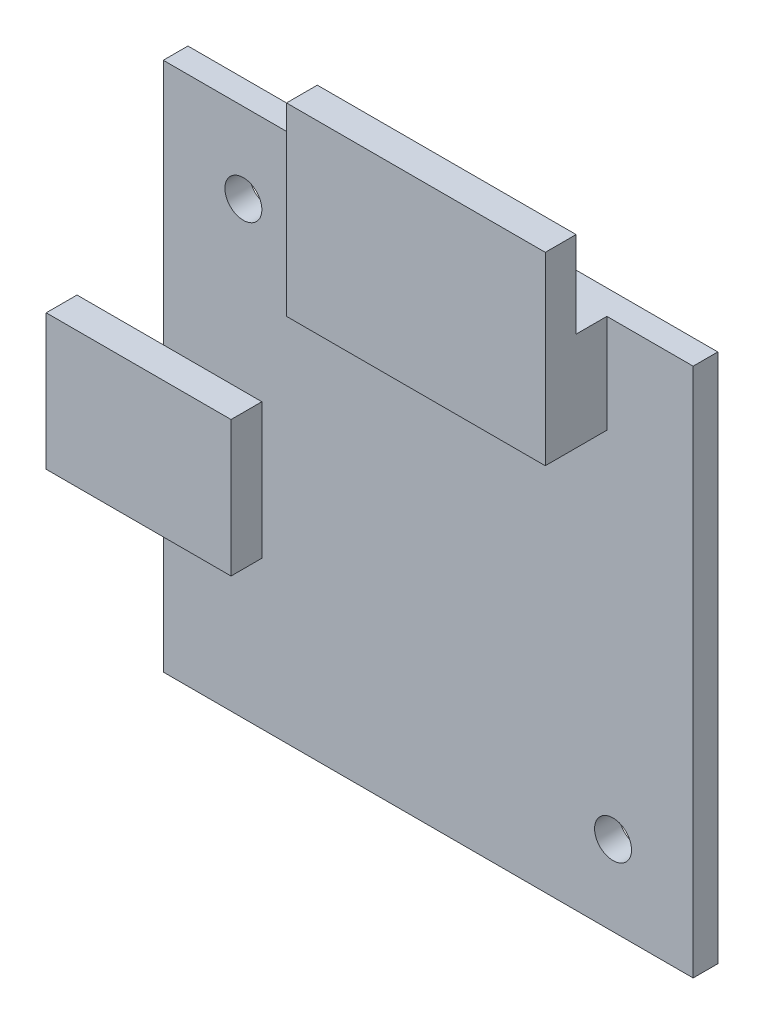
ISO-10303-21;
HEADER;
FILE_DESCRIPTION(('STEP AP214'),'2;1');
FILE_NAME('part.step','',(''),(''),'','','');
FILE_SCHEMA(('AUTOMOTIVE_DESIGN { 1 0 10303 214 1 1 1 1 }'));
ENDSEC;
DATA;
#1=APPLICATION_CONTEXT('core data for automotive mechanical design processes');
#2=APPLICATION_PROTOCOL_DEFINITION('international standard','automotive_design',2000,#1);
#3=PRODUCT_CONTEXT('',#1,'mechanical');
#4=PRODUCT('Part','Part','',(#3));
#5=PRODUCT_RELATED_PRODUCT_CATEGORY('part','',(#4));
#6=PRODUCT_DEFINITION_FORMATION('','',#4);
#7=PRODUCT_DEFINITION_CONTEXT('part definition',#1,'design');
#8=PRODUCT_DEFINITION('design','',#6,#7);
#9=PRODUCT_DEFINITION_SHAPE('','',#8);
#10=(LENGTH_UNIT() NAMED_UNIT(*) SI_UNIT(.MILLI.,.METRE.));
#11=(NAMED_UNIT(*) PLANE_ANGLE_UNIT() SI_UNIT($,.RADIAN.));
#12=(NAMED_UNIT(*) SI_UNIT($,.STERADIAN.) SOLID_ANGLE_UNIT());
#13=UNCERTAINTY_MEASURE_WITH_UNIT(LENGTH_MEASURE(1.E-05),#10,'distance_accuracy_value','');
#14=(GEOMETRIC_REPRESENTATION_CONTEXT(3) GLOBAL_UNCERTAINTY_ASSIGNED_CONTEXT((#13)) GLOBAL_UNIT_ASSIGNED_CONTEXT((#10,
#11,#12)) REPRESENTATION_CONTEXT('',''));
#15=CARTESIAN_POINT('',(0.,0.,0.));
#16=DIRECTION('',(0.,0.,1.));
#17=DIRECTION('',(1.,0.,0.));
#18=AXIS2_PLACEMENT_3D('',#15,#16,#17);
#19=CARTESIAN_POINT('',(15.,50.,7.));
#20=DIRECTION('',(0.,-1.,0.));
#21=DIRECTION('',(0.,0.,-1.));
#22=AXIS2_PLACEMENT_3D('',#19,#20,#21);
#23=PLANE('',#22);
#24=DIRECTION('',(1.,0.,0.));
#25=VECTOR('',#24,1.);
#26=CARTESIAN_POINT('',(36.,50.,4.5));
#27=LINE('',#26,#25);
#28=CARTESIAN_POINT('',(15.,50.,4.5));
#29=VERTEX_POINT('',#28);
#30=CARTESIAN_POINT('',(36.,50.,4.5));
#31=VERTEX_POINT('',#30);
#32=EDGE_CURVE('E172',#29,#31,#27,.T.);
#33=ORIENTED_EDGE('',*,*,#32,.F.);
#34=DIRECTION('',(0.,0.,-1.));
#35=VECTOR('',#34,1.);
#36=CARTESIAN_POINT('',(15.,50.,7.));
#37=LINE('',#36,#35);
#38=CARTESIAN_POINT('',(15.,50.,7.));
#39=VERTEX_POINT('',#38);
#40=EDGE_CURVE('E223',#39,#29,#37,.T.);
#41=ORIENTED_EDGE('',*,*,#40,.F.);
#42=DIRECTION('',(-1.,0.,0.));
#43=VECTOR('',#42,1.);
#44=CARTESIAN_POINT('',(15.,50.,7.));
#45=LINE('',#44,#43);
#46=CARTESIAN_POINT('',(36.,50.,7.));
#47=VERTEX_POINT('',#46);
#48=EDGE_CURVE('E222',#47,#39,#45,.T.);
#49=ORIENTED_EDGE('',*,*,#48,.F.);
#50=DIRECTION('',(0.,0.,-1.));
#51=VECTOR('',#50,1.);
#52=CARTESIAN_POINT('',(36.,50.,7.));
#53=LINE('',#52,#51);
#54=EDGE_CURVE('E230',#47,#31,#53,.T.);
#55=ORIENTED_EDGE('',*,*,#54,.T.);
#56=EDGE_LOOP('',(#33,#41,#49,#55));
#57=FACE_BOUND('',#56,.T.);
#58=ADVANCED_FACE('F47',(#57),#23,.F.);
#59=CARTESIAN_POINT('',(0.,0.,2.));
#60=DIRECTION('',(0.,0.,-1.));
#61=DIRECTION('',(-1.,0.,0.));
#62=AXIS2_PLACEMENT_3D('',#59,#60,#61);
#63=PLANE('',#62);
#64=CARTESIAN_POINT('',(36.5,6.5,2.));
#65=DIRECTION('',(0.,0.,1.));
#66=DIRECTION('',(1.,0.,0.));
#67=AXIS2_PLACEMENT_3D('',#64,#65,#66);
#68=CIRCLE('',#67,1.5);
#69=CARTESIAN_POINT('',(38.,6.5,2.));
#70=VERTEX_POINT('',#69);
#71=EDGE_CURVE('E238',#70,#70,#68,.T.);
#72=ORIENTED_EDGE('',*,*,#71,.F.);
#73=EDGE_LOOP('',(#72));
#74=FACE_BOUND('',#73,.T.);
#75=CARTESIAN_POINT('',(6.5,36.5,2.));
#76=DIRECTION('',(0.,0.,1.));
#77=DIRECTION('',(1.,0.,0.));
#78=AXIS2_PLACEMENT_3D('',#75,#76,#77);
#79=CIRCLE('',#78,1.5);
#80=CARTESIAN_POINT('',(8.,36.5,2.));
#81=VERTEX_POINT('',#80);
#82=EDGE_CURVE('E244',#81,#81,#79,.T.);
#83=ORIENTED_EDGE('',*,*,#82,.F.);
#84=EDGE_LOOP('',(#83));
#85=FACE_BOUND('',#84,.T.);
#86=DIRECTION('',(-1.,0.,0.));
#87=VECTOR('',#86,1.);
#88=CARTESIAN_POINT('',(8.,23.,2.));
#89=LINE('',#88,#87);
#90=CARTESIAN_POINT('',(8.,23.,2.));
#91=VERTEX_POINT('',#90);
#92=CARTESIAN_POINT('',(0.,23.,2.));
#93=VERTEX_POINT('',#92);
#94=EDGE_CURVE('E63',#91,#93,#89,.T.);
#95=ORIENTED_EDGE('',*,*,#94,.F.);
#96=DIRECTION('',(0.,1.,0.));
#97=VECTOR('',#96,1.);
#98=CARTESIAN_POINT('',(8.,12.,2.));
#99=LINE('',#98,#97);
#100=CARTESIAN_POINT('',(8.,12.,2.));
#101=VERTEX_POINT('',#100);
#102=EDGE_CURVE('E68',#101,#91,#99,.T.);
#103=ORIENTED_EDGE('',*,*,#102,.F.);
#104=DIRECTION('',(1.,0.,0.));
#105=VECTOR('',#104,1.);
#106=CARTESIAN_POINT('',(8.,12.,2.));
#107=LINE('',#106,#105);
#108=CARTESIAN_POINT('',(0.,12.,2.));
#109=VERTEX_POINT('',#108);
#110=EDGE_CURVE('E201',#109,#101,#107,.T.);
#111=ORIENTED_EDGE('',*,*,#110,.F.);
#112=DIRECTION('',(0.,-1.,0.));
#113=VECTOR('',#112,1.);
#114=CARTESIAN_POINT('',(0.,0.,2.));
#115=LINE('',#114,#113);
#116=CARTESIAN_POINT('',(0.,0.,2.));
#117=VERTEX_POINT('',#116);
#118=EDGE_CURVE('E254',#109,#117,#115,.T.);
#119=ORIENTED_EDGE('',*,*,#118,.T.);
#120=DIRECTION('',(1.,0.,0.));
#121=VECTOR('',#120,1.);
#122=CARTESIAN_POINT('',(0.,0.,2.));
#123=LINE('',#122,#121);
#124=CARTESIAN_POINT('',(43.,0.,2.));
#125=VERTEX_POINT('',#124);
#126=EDGE_CURVE('E252',#117,#125,#123,.T.);
#127=ORIENTED_EDGE('',*,*,#126,.T.);
#128=DIRECTION('',(0.,1.,0.));
#129=VECTOR('',#128,1.);
#130=CARTESIAN_POINT('',(43.,0.,2.));
#131=LINE('',#130,#129);
#132=CARTESIAN_POINT('',(43.,43.,2.));
#133=VERTEX_POINT('',#132);
#134=EDGE_CURVE('E256',#125,#133,#131,.T.);
#135=ORIENTED_EDGE('',*,*,#134,.T.);
#136=DIRECTION('',(-1.,0.,0.));
#137=VECTOR('',#136,1.);
#138=CARTESIAN_POINT('',(0.,43.,2.));
#139=LINE('',#138,#137);
#140=CARTESIAN_POINT('',(36.,43.,2.));
#141=VERTEX_POINT('',#140);
#142=EDGE_CURVE('E259',#133,#141,#139,.T.);
#143=ORIENTED_EDGE('',*,*,#142,.T.);
#144=DIRECTION('',(0.,1.,0.));
#145=VECTOR('',#144,1.);
#146=CARTESIAN_POINT('',(36.,35.,2.));
#147=LINE('',#146,#145);
#148=CARTESIAN_POINT('',(36.,35.,2.));
#149=VERTEX_POINT('',#148);
#150=EDGE_CURVE('E180',#149,#141,#147,.T.);
#151=ORIENTED_EDGE('',*,*,#150,.F.);
#152=DIRECTION('',(1.,0.,0.));
#153=VECTOR('',#152,1.);
#154=CARTESIAN_POINT('',(15.,35.,2.));
#155=LINE('',#154,#153);
#156=CARTESIAN_POINT('',(15.,35.,2.));
#157=VERTEX_POINT('',#156);
#158=EDGE_CURVE('E214',#157,#149,#155,.T.);
#159=ORIENTED_EDGE('',*,*,#158,.F.);
#160=DIRECTION('',(0.,-1.,0.));
#161=VECTOR('',#160,1.);
#162=CARTESIAN_POINT('',(15.,35.,2.));
#163=LINE('',#162,#161);
#164=CARTESIAN_POINT('',(15.,43.,2.));
#165=VERTEX_POINT('',#164);
#166=EDGE_CURVE('E13',#165,#157,#163,.T.);
#167=ORIENTED_EDGE('',*,*,#166,.F.);
#168=CARTESIAN_POINT('',(0.,43.,2.));
#169=VERTEX_POINT('',#168);
#170=EDGE_CURVE('E258',#165,#169,#139,.T.);
#171=ORIENTED_EDGE('',*,*,#170,.T.);
#172=EDGE_CURVE('E250',#169,#93,#115,.T.);
#173=ORIENTED_EDGE('',*,*,#172,.T.);
#174=EDGE_LOOP('',(#95,#103,#111,#119,#127,#135,#143,#151,#159,#167,#171,#173));
#175=FACE_BOUND('',#174,.T.);
#176=ADVANCED_FACE('F294',(#74,#85,#175),#63,.F.);
#177=CARTESIAN_POINT('',(0.,0.,2.));
#178=DIRECTION('',(1.,0.,0.));
#179=DIRECTION('',(0.,0.,-1.));
#180=AXIS2_PLACEMENT_3D('',#177,#178,#179);
#181=PLANE('',#180);
#182=DIRECTION('',(0.,-1.,0.));
#183=VECTOR('',#182,1.);
#184=CARTESIAN_POINT('',(0.,0.,0.));
#185=LINE('',#184,#183);
#186=CARTESIAN_POINT('',(0.,43.,0.));
#187=VERTEX_POINT('',#186);
#188=CARTESIAN_POINT('',(0.,0.,0.));
#189=VERTEX_POINT('',#188);
#190=EDGE_CURVE('E247',#187,#189,#185,.T.);
#191=ORIENTED_EDGE('',*,*,#190,.T.);
#192=DIRECTION('',(0.,0.,-1.));
#193=VECTOR('',#192,1.);
#194=CARTESIAN_POINT('',(0.,0.,2.));
#195=LINE('',#194,#193);
#196=EDGE_CURVE('E51',#117,#189,#195,.T.);
#197=ORIENTED_EDGE('',*,*,#196,.F.);
#198=ORIENTED_EDGE('',*,*,#118,.F.);
#199=EDGE_CURVE('E253',#93,#109,#115,.T.);
#200=ORIENTED_EDGE('',*,*,#199,.F.);
#201=ORIENTED_EDGE('',*,*,#172,.F.);
#202=DIRECTION('',(0.,0.,-1.));
#203=VECTOR('',#202,1.);
#204=CARTESIAN_POINT('',(0.,43.,2.));
#205=LINE('',#204,#203);
#206=EDGE_CURVE('E261',#169,#187,#205,.T.);
#207=ORIENTED_EDGE('',*,*,#206,.T.);
#208=EDGE_LOOP('',(#191,#197,#198,#200,#201,#207));
#209=FACE_BOUND('',#208,.T.);
#210=ADVANCED_FACE('F49',(#209),#181,.F.);
#211=CARTESIAN_POINT('',(0.,0.,2.));
#212=DIRECTION('',(0.,1.,0.));
#213=DIRECTION('',(0.,0.,1.));
#214=AXIS2_PLACEMENT_3D('',#211,#212,#213);
#215=PLANE('',#214);
#216=DIRECTION('',(1.,0.,0.));
#217=VECTOR('',#216,1.);
#218=CARTESIAN_POINT('',(0.,0.,0.));
#219=LINE('',#218,#217);
#220=CARTESIAN_POINT('',(43.,0.,0.));
#221=VERTEX_POINT('',#220);
#222=EDGE_CURVE('E264',#189,#221,#219,.T.);
#223=ORIENTED_EDGE('',*,*,#222,.T.);
#224=DIRECTION('',(0.,0.,-1.));
#225=VECTOR('',#224,1.);
#226=CARTESIAN_POINT('',(43.,0.,2.));
#227=LINE('',#226,#225);
#228=EDGE_CURVE('E274',#125,#221,#227,.T.);
#229=ORIENTED_EDGE('',*,*,#228,.F.);
#230=ORIENTED_EDGE('',*,*,#126,.F.);
#231=ORIENTED_EDGE('',*,*,#196,.T.);
#232=EDGE_LOOP('',(#223,#229,#230,#231));
#233=FACE_BOUND('',#232,.T.);
#234=ADVANCED_FACE('F284',(#233),#215,.F.);
#235=CARTESIAN_POINT('',(43.,0.,2.));
#236=DIRECTION('',(-1.,0.,0.));
#237=DIRECTION('',(0.,0.,1.));
#238=AXIS2_PLACEMENT_3D('',#235,#236,#237);
#239=PLANE('',#238);
#240=DIRECTION('',(0.,1.,0.));
#241=VECTOR('',#240,1.);
#242=CARTESIAN_POINT('',(43.,0.,0.));
#243=LINE('',#242,#241);
#244=CARTESIAN_POINT('',(43.,43.,0.));
#245=VERTEX_POINT('',#244);
#246=EDGE_CURVE('E266',#221,#245,#243,.T.);
#247=ORIENTED_EDGE('',*,*,#246,.T.);
#248=DIRECTION('',(0.,0.,-1.));
#249=VECTOR('',#248,1.);
#250=CARTESIAN_POINT('',(43.,43.,2.));
#251=LINE('',#250,#249);
#252=EDGE_CURVE('E272',#133,#245,#251,.T.);
#253=ORIENTED_EDGE('',*,*,#252,.F.);
#254=ORIENTED_EDGE('',*,*,#134,.F.);
#255=ORIENTED_EDGE('',*,*,#228,.T.);
#256=EDGE_LOOP('',(#247,#253,#254,#255));
#257=FACE_BOUND('',#256,.T.);
#258=ADVANCED_FACE('F293',(#257),#239,.F.);
#259=CARTESIAN_POINT('',(0.,43.,2.));
#260=DIRECTION('',(0.,-1.,0.));
#261=DIRECTION('',(0.,0.,-1.));
#262=AXIS2_PLACEMENT_3D('',#259,#260,#261);
#263=PLANE('',#262);
#264=DIRECTION('',(-1.,0.,0.));
#265=VECTOR('',#264,1.);
#266=CARTESIAN_POINT('',(0.,43.,0.));
#267=LINE('',#266,#265);
#268=EDGE_CURVE('E268',#245,#187,#267,.T.);
#269=ORIENTED_EDGE('',*,*,#268,.T.);
#270=ORIENTED_EDGE('',*,*,#206,.F.);
#271=ORIENTED_EDGE('',*,*,#170,.F.);
#272=DIRECTION('',(0.,0.,-1.));
#273=VECTOR('',#272,1.);
#274=CARTESIAN_POINT('',(15.,43.,4.5));
#275=LINE('',#274,#273);
#276=CARTESIAN_POINT('',(15.,43.,4.5));
#277=VERTEX_POINT('',#276);
#278=EDGE_CURVE('E163',#277,#165,#275,.T.);
#279=ORIENTED_EDGE('',*,*,#278,.F.);
#280=DIRECTION('',(-1.,0.,0.));
#281=VECTOR('',#280,1.);
#282=CARTESIAN_POINT('',(36.,43.,4.5));
#283=LINE('',#282,#281);
#284=CARTESIAN_POINT('',(36.,43.,4.5));
#285=VERTEX_POINT('',#284);
#286=EDGE_CURVE('E155',#285,#277,#283,.T.);
#287=ORIENTED_EDGE('',*,*,#286,.F.);
#288=DIRECTION('',(0.,0.,-1.));
#289=VECTOR('',#288,1.);
#290=CARTESIAN_POINT('',(36.,43.,4.5));
#291=LINE('',#290,#289);
#292=EDGE_CURVE('E160',#285,#141,#291,.T.);
#293=ORIENTED_EDGE('',*,*,#292,.T.);
#294=ORIENTED_EDGE('',*,*,#142,.F.);
#295=ORIENTED_EDGE('',*,*,#252,.T.);
#296=EDGE_LOOP('',(#269,#270,#271,#279,#287,#293,#294,#295));
#297=FACE_BOUND('',#296,.T.);
#298=ADVANCED_FACE('F157',(#297),#263,.F.);
#299=CARTESIAN_POINT('',(0.,0.,0.));
#300=DIRECTION('',(0.,0.,-1.));
#301=DIRECTION('',(-1.,0.,0.));
#302=AXIS2_PLACEMENT_3D('',#299,#300,#301);
#303=PLANE('',#302);
#304=CARTESIAN_POINT('',(36.5,6.5,0.));
#305=DIRECTION('',(0.,0.,-1.));
#306=DIRECTION('',(-1.,0.,0.));
#307=AXIS2_PLACEMENT_3D('',#304,#305,#306);
#308=CIRCLE('',#307,1.5);
#309=CARTESIAN_POINT('',(35.,6.5,0.));
#310=VERTEX_POINT('',#309);
#311=EDGE_CURVE('E237',#310,#310,#308,.F.);
#312=ORIENTED_EDGE('',*,*,#311,.T.);
#313=EDGE_LOOP('',(#312));
#314=FACE_BOUND('',#313,.T.);
#315=CARTESIAN_POINT('',(6.5,36.5,0.));
#316=DIRECTION('',(0.,0.,-1.));
#317=DIRECTION('',(-1.,0.,0.));
#318=AXIS2_PLACEMENT_3D('',#315,#316,#317);
#319=CIRCLE('',#318,1.5);
#320=CARTESIAN_POINT('',(5.,36.5,0.));
#321=VERTEX_POINT('',#320);
#322=EDGE_CURVE('E241',#321,#321,#319,.F.);
#323=ORIENTED_EDGE('',*,*,#322,.T.);
#324=EDGE_LOOP('',(#323));
#325=FACE_BOUND('',#324,.T.);
#326=ORIENTED_EDGE('',*,*,#190,.F.);
#327=ORIENTED_EDGE('',*,*,#268,.F.);
#328=ORIENTED_EDGE('',*,*,#246,.F.);
#329=ORIENTED_EDGE('',*,*,#222,.F.);
#330=EDGE_LOOP('',(#326,#327,#328,#329));
#331=FACE_BOUND('',#330,.T.);
#332=ADVANCED_FACE('F291',(#314,#325,#331),#303,.T.);
#333=CARTESIAN_POINT('',(6.5,36.5,-0.00100000000000013));
#334=DIRECTION('',(0.,0.,1.));
#335=DIRECTION('',(1.,0.,0.));
#336=AXIS2_PLACEMENT_3D('',#333,#334,#335);
#337=CYLINDRICAL_SURFACE('',#336,1.5);
#338=ORIENTED_EDGE('',*,*,#322,.F.);
#339=EDGE_LOOP('',(#338));
#340=FACE_BOUND('',#339,.T.);
#341=ORIENTED_EDGE('',*,*,#82,.T.);
#342=EDGE_LOOP('',(#341));
#343=FACE_BOUND('',#342,.T.);
#344=ADVANCED_FACE('F352',(#340,#343),#337,.F.);
#345=CARTESIAN_POINT('',(36.5,6.5,-0.00100000000000013));
#346=DIRECTION('',(0.,0.,1.));
#347=DIRECTION('',(1.,0.,0.));
#348=AXIS2_PLACEMENT_3D('',#345,#346,#347);
#349=CYLINDRICAL_SURFACE('',#348,1.5);
#350=ORIENTED_EDGE('',*,*,#311,.F.);
#351=EDGE_LOOP('',(#350));
#352=FACE_BOUND('',#351,.T.);
#353=ORIENTED_EDGE('',*,*,#71,.T.);
#354=EDGE_LOOP('',(#353));
#355=FACE_BOUND('',#354,.T.);
#356=ADVANCED_FACE('F348',(#352,#355),#349,.F.);
#357=CARTESIAN_POINT('',(15.,35.,7.));
#358=DIRECTION('',(1.,0.,0.));
#359=DIRECTION('',(0.,0.,-1.));
#360=AXIS2_PLACEMENT_3D('',#357,#358,#359);
#361=PLANE('',#360);
#362=DIRECTION('',(0.,1.,0.));
#363=VECTOR('',#362,1.);
#364=CARTESIAN_POINT('',(15.,50.,4.5));
#365=LINE('',#364,#363);
#366=EDGE_CURVE('E166',#277,#29,#365,.T.);
#367=ORIENTED_EDGE('',*,*,#366,.F.);
#368=ORIENTED_EDGE('',*,*,#278,.T.);
#369=ORIENTED_EDGE('',*,*,#166,.T.);
#370=DIRECTION('',(0.,0.,-1.));
#371=VECTOR('',#370,1.);
#372=CARTESIAN_POINT('',(15.,35.,7.));
#373=LINE('',#372,#371);
#374=CARTESIAN_POINT('',(15.,35.,7.));
#375=VERTEX_POINT('',#374);
#376=EDGE_CURVE('E234',#375,#157,#373,.T.);
#377=ORIENTED_EDGE('',*,*,#376,.F.);
#378=DIRECTION('',(0.,-1.,0.));
#379=VECTOR('',#378,1.);
#380=CARTESIAN_POINT('',(15.,35.,7.));
#381=LINE('',#380,#379);
#382=EDGE_CURVE('E215',#39,#375,#381,.T.);
#383=ORIENTED_EDGE('',*,*,#382,.F.);
#384=ORIENTED_EDGE('',*,*,#40,.T.);
#385=EDGE_LOOP('',(#367,#368,#369,#377,#383,#384));
#386=FACE_BOUND('',#385,.T.);
#387=ADVANCED_FACE('F344',(#386),#361,.F.);
#388=CARTESIAN_POINT('',(15.,35.,7.));
#389=DIRECTION('',(0.,1.,0.));
#390=DIRECTION('',(0.,0.,1.));
#391=AXIS2_PLACEMENT_3D('',#388,#389,#390);
#392=PLANE('',#391);
#393=ORIENTED_EDGE('',*,*,#158,.T.);
#394=DIRECTION('',(0.,0.,-1.));
#395=VECTOR('',#394,1.);
#396=CARTESIAN_POINT('',(36.,35.,7.));
#397=LINE('',#396,#395);
#398=CARTESIAN_POINT('',(36.,35.,7.));
#399=VERTEX_POINT('',#398);
#400=EDGE_CURVE('E232',#399,#149,#397,.T.);
#401=ORIENTED_EDGE('',*,*,#400,.F.);
#402=DIRECTION('',(1.,0.,0.));
#403=VECTOR('',#402,1.);
#404=CARTESIAN_POINT('',(15.,35.,7.));
#405=LINE('',#404,#403);
#406=EDGE_CURVE('E218',#375,#399,#405,.T.);
#407=ORIENTED_EDGE('',*,*,#406,.F.);
#408=ORIENTED_EDGE('',*,*,#376,.T.);
#409=EDGE_LOOP('',(#393,#401,#407,#408));
#410=FACE_BOUND('',#409,.T.);
#411=ADVANCED_FACE('F341',(#410),#392,.F.);
#412=CARTESIAN_POINT('',(36.,35.,7.));
#413=DIRECTION('',(-1.,0.,0.));
#414=DIRECTION('',(0.,0.,1.));
#415=AXIS2_PLACEMENT_3D('',#412,#413,#414);
#416=PLANE('',#415);
#417=ORIENTED_EDGE('',*,*,#150,.T.);
#418=ORIENTED_EDGE('',*,*,#292,.F.);
#419=DIRECTION('',(0.,-1.,0.));
#420=VECTOR('',#419,1.);
#421=CARTESIAN_POINT('',(36.,50.,4.5));
#422=LINE('',#421,#420);
#423=EDGE_CURVE('E167',#31,#285,#422,.T.);
#424=ORIENTED_EDGE('',*,*,#423,.F.);
#425=ORIENTED_EDGE('',*,*,#54,.F.);
#426=DIRECTION('',(0.,1.,0.));
#427=VECTOR('',#426,1.);
#428=CARTESIAN_POINT('',(36.,35.,7.));
#429=LINE('',#428,#427);
#430=EDGE_CURVE('E220',#399,#47,#429,.T.);
#431=ORIENTED_EDGE('',*,*,#430,.F.);
#432=ORIENTED_EDGE('',*,*,#400,.T.);
#433=EDGE_LOOP('',(#417,#418,#424,#425,#431,#432));
#434=FACE_BOUND('',#433,.T.);
#435=ADVANCED_FACE('F178',(#434),#416,.F.);
#436=CARTESIAN_POINT('',(0.,0.,7.));
#437=DIRECTION('',(0.,0.,-1.));
#438=DIRECTION('',(-1.,0.,0.));
#439=AXIS2_PLACEMENT_3D('',#436,#437,#438);
#440=PLANE('',#439);
#441=ORIENTED_EDGE('',*,*,#382,.T.);
#442=ORIENTED_EDGE('',*,*,#406,.T.);
#443=ORIENTED_EDGE('',*,*,#430,.T.);
#444=ORIENTED_EDGE('',*,*,#48,.T.);
#445=EDGE_LOOP('',(#441,#442,#443,#444));
#446=FACE_BOUND('',#445,.T.);
#447=ADVANCED_FACE('F337',(#446),#440,.F.);
#448=CARTESIAN_POINT('',(0.,0.,2.));
#449=DIRECTION('',(0.,0.,1.));
#450=DIRECTION('',(1.,0.,0.));
#451=AXIS2_PLACEMENT_3D('',#448,#449,#450);
#452=PLANE('',#451);
#453=CARTESIAN_POINT('',(-7.,23.,2.));
#454=VERTEX_POINT('',#453);
#455=EDGE_CURVE('E197',#93,#454,#89,.T.);
#456=ORIENTED_EDGE('',*,*,#455,.F.);
#457=ORIENTED_EDGE('',*,*,#199,.T.);
#458=CARTESIAN_POINT('',(-7.,12.,2.));
#459=VERTEX_POINT('',#458);
#460=EDGE_CURVE('E189',#459,#109,#107,.T.);
#461=ORIENTED_EDGE('',*,*,#460,.F.);
#462=DIRECTION('',(0.,-1.,0.));
#463=VECTOR('',#462,1.);
#464=CARTESIAN_POINT('',(-7.,12.,2.));
#465=LINE('',#464,#463);
#466=EDGE_CURVE('E199',#454,#459,#465,.T.);
#467=ORIENTED_EDGE('',*,*,#466,.F.);
#468=EDGE_LOOP('',(#456,#457,#461,#467));
#469=FACE_BOUND('',#468,.T.);
#470=ADVANCED_FACE('F299',(#469),#452,.F.);
#471=CARTESIAN_POINT('',(8.,12.,4.5));
#472=DIRECTION('',(-1.,0.,0.));
#473=DIRECTION('',(0.,-1.,0.));
#474=AXIS2_PLACEMENT_3D('',#471,#472,#473);
#475=PLANE('',#474);
#476=ORIENTED_EDGE('',*,*,#102,.T.);
#477=DIRECTION('',(0.,0.,-1.));
#478=VECTOR('',#477,1.);
#479=CARTESIAN_POINT('',(8.,23.,4.5));
#480=LINE('',#479,#478);
#481=CARTESIAN_POINT('',(8.,23.,4.5));
#482=VERTEX_POINT('',#481);
#483=EDGE_CURVE('E212',#482,#91,#480,.T.);
#484=ORIENTED_EDGE('',*,*,#483,.F.);
#485=DIRECTION('',(0.,1.,0.));
#486=VECTOR('',#485,1.);
#487=CARTESIAN_POINT('',(8.,12.,4.5));
#488=LINE('',#487,#486);
#489=CARTESIAN_POINT('',(8.,12.,4.5));
#490=VERTEX_POINT('',#489);
#491=EDGE_CURVE('E185',#490,#482,#488,.T.);
#492=ORIENTED_EDGE('',*,*,#491,.F.);
#493=DIRECTION('',(0.,0.,-1.));
#494=VECTOR('',#493,1.);
#495=CARTESIAN_POINT('',(8.,12.,4.5));
#496=LINE('',#495,#494);
#497=EDGE_CURVE('E195',#490,#101,#496,.T.);
#498=ORIENTED_EDGE('',*,*,#497,.T.);
#499=EDGE_LOOP('',(#476,#484,#492,#498));
#500=FACE_BOUND('',#499,.T.);
#501=ADVANCED_FACE('F315',(#500),#475,.F.);
#502=CARTESIAN_POINT('',(8.,23.,4.5));
#503=DIRECTION('',(0.,-1.,0.));
#504=DIRECTION('',(1.,0.,0.));
#505=AXIS2_PLACEMENT_3D('',#502,#503,#504);
#506=PLANE('',#505);
#507=ORIENTED_EDGE('',*,*,#94,.T.);
#508=ORIENTED_EDGE('',*,*,#455,.T.);
#509=DIRECTION('',(0.,0.,-1.));
#510=VECTOR('',#509,1.);
#511=CARTESIAN_POINT('',(-7.,23.,4.5));
#512=LINE('',#511,#510);
#513=CARTESIAN_POINT('',(-7.,23.,4.5));
#514=VERTEX_POINT('',#513);
#515=EDGE_CURVE('E209',#514,#454,#512,.T.);
#516=ORIENTED_EDGE('',*,*,#515,.F.);
#517=DIRECTION('',(-1.,0.,0.));
#518=VECTOR('',#517,1.);
#519=CARTESIAN_POINT('',(8.,23.,4.5));
#520=LINE('',#519,#518);
#521=EDGE_CURVE('E188',#482,#514,#520,.T.);
#522=ORIENTED_EDGE('',*,*,#521,.F.);
#523=ORIENTED_EDGE('',*,*,#483,.T.);
#524=EDGE_LOOP('',(#507,#508,#516,#522,#523));
#525=FACE_BOUND('',#524,.T.);
#526=ADVANCED_FACE('F311',(#525),#506,.F.);
#527=CARTESIAN_POINT('',(-7.,12.,4.5));
#528=DIRECTION('',(1.,0.,0.));
#529=DIRECTION('',(0.,0.,-1.));
#530=AXIS2_PLACEMENT_3D('',#527,#528,#529);
#531=PLANE('',#530);
#532=ORIENTED_EDGE('',*,*,#466,.T.);
#533=DIRECTION('',(0.,0.,-1.));
#534=VECTOR('',#533,1.);
#535=CARTESIAN_POINT('',(-7.,12.,4.5));
#536=LINE('',#535,#534);
#537=CARTESIAN_POINT('',(-7.,12.,4.5));
#538=VERTEX_POINT('',#537);
#539=EDGE_CURVE('E206',#538,#459,#536,.T.);
#540=ORIENTED_EDGE('',*,*,#539,.F.);
#541=DIRECTION('',(0.,-1.,0.));
#542=VECTOR('',#541,1.);
#543=CARTESIAN_POINT('',(-7.,12.,4.5));
#544=LINE('',#543,#542);
#545=EDGE_CURVE('E191',#514,#538,#544,.T.);
#546=ORIENTED_EDGE('',*,*,#545,.F.);
#547=ORIENTED_EDGE('',*,*,#515,.T.);
#548=EDGE_LOOP('',(#532,#540,#546,#547));
#549=FACE_BOUND('',#548,.T.);
#550=ADVANCED_FACE('F308',(#549),#531,.F.);
#551=CARTESIAN_POINT('',(8.,12.,4.5));
#552=DIRECTION('',(0.,1.,0.));
#553=DIRECTION('',(0.,0.,1.));
#554=AXIS2_PLACEMENT_3D('',#551,#552,#553);
#555=PLANE('',#554);
#556=ORIENTED_EDGE('',*,*,#460,.T.);
#557=ORIENTED_EDGE('',*,*,#110,.T.);
#558=ORIENTED_EDGE('',*,*,#497,.F.);
#559=DIRECTION('',(1.,0.,0.));
#560=VECTOR('',#559,1.);
#561=CARTESIAN_POINT('',(8.,12.,4.5));
#562=LINE('',#561,#560);
#563=EDGE_CURVE('E193',#538,#490,#562,.T.);
#564=ORIENTED_EDGE('',*,*,#563,.F.);
#565=ORIENTED_EDGE('',*,*,#539,.T.);
#566=EDGE_LOOP('',(#556,#557,#558,#564,#565));
#567=FACE_BOUND('',#566,.T.);
#568=ADVANCED_FACE('F302',(#567),#555,.F.);
#569=CARTESIAN_POINT('',(0.,0.,4.5));
#570=DIRECTION('',(0.,0.,1.));
#571=DIRECTION('',(1.,0.,0.));
#572=AXIS2_PLACEMENT_3D('',#569,#570,#571);
#573=PLANE('',#572);
#574=ORIENTED_EDGE('',*,*,#491,.T.);
#575=ORIENTED_EDGE('',*,*,#521,.T.);
#576=ORIENTED_EDGE('',*,*,#545,.T.);
#577=ORIENTED_EDGE('',*,*,#563,.T.);
#578=EDGE_LOOP('',(#574,#575,#576,#577));
#579=FACE_BOUND('',#578,.T.);
#580=ADVANCED_FACE('F317',(#579),#573,.T.);
#581=CARTESIAN_POINT('',(0.,0.,4.5));
#582=DIRECTION('',(0.,0.,-1.));
#583=DIRECTION('',(-1.,0.,0.));
#584=AXIS2_PLACEMENT_3D('',#581,#582,#583);
#585=PLANE('',#584);
#586=ORIENTED_EDGE('',*,*,#423,.T.);
#587=ORIENTED_EDGE('',*,*,#286,.T.);
#588=ORIENTED_EDGE('',*,*,#366,.T.);
#589=ORIENTED_EDGE('',*,*,#32,.T.);
#590=EDGE_LOOP('',(#586,#587,#588,#589));
#591=FACE_BOUND('',#590,.T.);
#592=ADVANCED_FACE('F170',(#591),#585,.T.);
#593=CLOSED_SHELL('',(#58,#176,#210,#234,#258,#298,#332,#344,#356,#387,#411,#435,#447,#470,#501,
#526,#550,#568,#580,#592));
#594=MANIFOLD_SOLID_BREP('B2',#593);
#595=ADVANCED_BREP_SHAPE_REPRESENTATION('',(#18,#594),#14);
#596=SHAPE_DEFINITION_REPRESENTATION(#9,#595);
ENDSEC;
END-ISO-10303-21;
